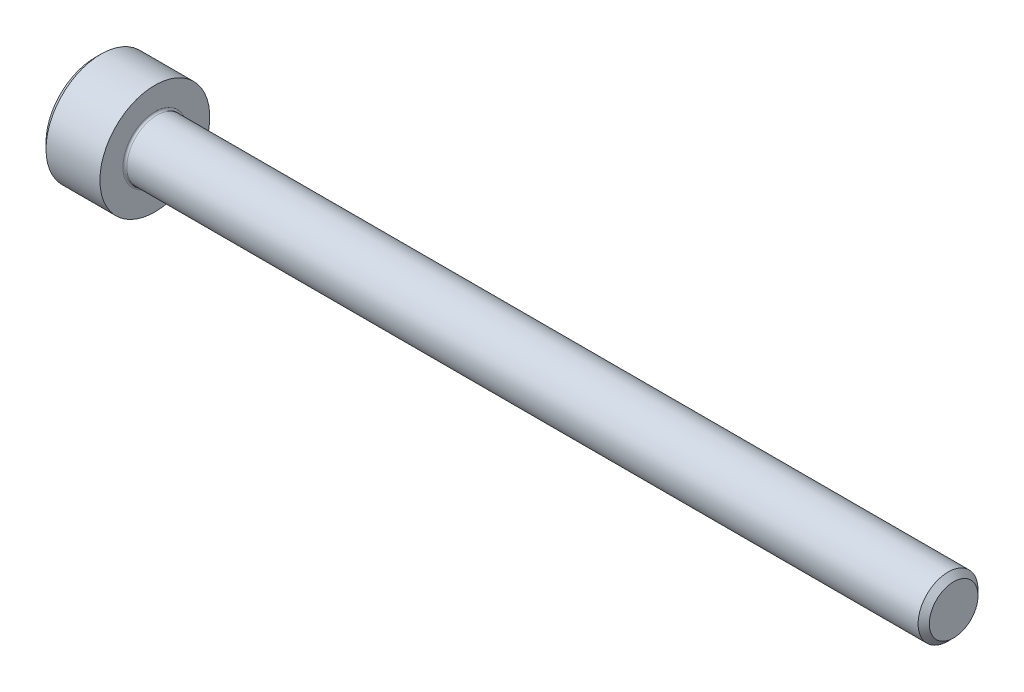
ISO-10303-21;
HEADER;
FILE_DESCRIPTION(('STEP AP214'),'2;1');
FILE_NAME('part.step','',(''),(''),'','','');
FILE_SCHEMA(('AUTOMOTIVE_DESIGN { 1 0 10303 214 1 1 1 1 }'));
ENDSEC;
DATA;
#1=APPLICATION_CONTEXT('core data for automotive mechanical design processes');
#2=APPLICATION_PROTOCOL_DEFINITION('international standard','automotive_design',2000,#1);
#3=PRODUCT_CONTEXT('',#1,'mechanical');
#4=PRODUCT('Part','Part','',(#3));
#5=PRODUCT_RELATED_PRODUCT_CATEGORY('part','',(#4));
#6=PRODUCT_DEFINITION_FORMATION('','',#4);
#7=PRODUCT_DEFINITION_CONTEXT('part definition',#1,'design');
#8=PRODUCT_DEFINITION('design','',#6,#7);
#9=PRODUCT_DEFINITION_SHAPE('','',#8);
#10=(LENGTH_UNIT() NAMED_UNIT(*) SI_UNIT(.MILLI.,.METRE.));
#11=(NAMED_UNIT(*) PLANE_ANGLE_UNIT() SI_UNIT($,.RADIAN.));
#12=(NAMED_UNIT(*) SI_UNIT($,.STERADIAN.) SOLID_ANGLE_UNIT());
#13=UNCERTAINTY_MEASURE_WITH_UNIT(LENGTH_MEASURE(1.E-05),#10,'distance_accuracy_value','');
#14=(GEOMETRIC_REPRESENTATION_CONTEXT(3) GLOBAL_UNCERTAINTY_ASSIGNED_CONTEXT((#13)) GLOBAL_UNIT_ASSIGNED_CONTEXT((#10,
#11,#12)) REPRESENTATION_CONTEXT('',''));
#15=CARTESIAN_POINT('',(0.,0.,0.));
#16=DIRECTION('',(0.,0.,1.));
#17=DIRECTION('',(1.,0.,0.));
#18=AXIS2_PLACEMENT_3D('',#15,#16,#17);
#19=CARTESIAN_POINT('',(0.,0.,0.));
#20=DIRECTION('',(-1.,0.,0.));
#21=DIRECTION('',(0.,0.,1.));
#22=AXIS2_PLACEMENT_3D('',#19,#20,#21);
#23=PLANE('',#22);
#24=DIRECTION('',(0.,-0.499999999999998,0.86602540378444));
#25=VECTOR('',#24,1.);
#26=CARTESIAN_POINT('',(0.,1.47801668912544,0.));
#27=LINE('',#26,#25);
#28=CARTESIAN_POINT('',(0.,1.47801668912544,0.));
#29=VERTEX_POINT('',#28);
#30=CARTESIAN_POINT('',(0.,0.73900834456272,1.28));
#31=VERTEX_POINT('',#30);
#32=EDGE_CURVE('E390',#29,#31,#27,.T.);
#33=ORIENTED_EDGE('',*,*,#32,.T.);
#34=DIRECTION('',(0.,1.,0.));
#35=VECTOR('',#34,1.);
#36=CARTESIAN_POINT('',(0.,-0.739008344562722,1.28));
#37=LINE('',#36,#35);
#38=CARTESIAN_POINT('',(0.,-0.739008344562722,1.28));
#39=VERTEX_POINT('',#38);
#40=EDGE_CURVE('E126',#39,#31,#37,.T.);
#41=ORIENTED_EDGE('',*,*,#40,.F.);
#42=DIRECTION('',(0.,-0.500000000000001,-0.866025403784438));
#43=VECTOR('',#42,1.);
#44=CARTESIAN_POINT('',(0.,-0.739008344562722,1.28));
#45=LINE('',#44,#43);
#46=CARTESIAN_POINT('',(0.,-1.47801668912545,0.));
#47=VERTEX_POINT('',#46);
#48=EDGE_CURVE('E393',#39,#47,#45,.T.);
#49=ORIENTED_EDGE('',*,*,#48,.T.);
#50=DIRECTION('',(0.,0.499999999999998,-0.86602540378444));
#51=VECTOR('',#50,1.);
#52=CARTESIAN_POINT('',(0.,-1.47801668912545,0.));
#53=LINE('',#52,#51);
#54=CARTESIAN_POINT('',(0.,-0.739008344562726,-1.28));
#55=VERTEX_POINT('',#54);
#56=EDGE_CURVE('E396',#47,#55,#53,.T.);
#57=ORIENTED_EDGE('',*,*,#56,.T.);
#58=DIRECTION('',(0.,-1.,0.));
#59=VECTOR('',#58,1.);
#60=CARTESIAN_POINT('',(0.,0.739008344562716,-1.28));
#61=LINE('',#60,#59);
#62=CARTESIAN_POINT('',(0.,0.739008344562716,-1.28));
#63=VERTEX_POINT('',#62);
#64=EDGE_CURVE('E399',#63,#55,#61,.T.);
#65=ORIENTED_EDGE('',*,*,#64,.F.);
#66=DIRECTION('',(0.,-0.500000000000001,-0.866025403784438));
#67=VECTOR('',#66,1.);
#68=CARTESIAN_POINT('',(0.,1.47801668912544,0.));
#69=LINE('',#68,#67);
#70=EDGE_CURVE('E121',#29,#63,#69,.T.);
#71=ORIENTED_EDGE('',*,*,#70,.F.);
#72=EDGE_LOOP('',(#33,#41,#49,#57,#65,#71));
#73=FACE_BOUND('',#72,.T.);
#74=CARTESIAN_POINT('',(0.,0.,0.));
#75=DIRECTION('',(-1.,0.,0.));
#76=DIRECTION('',(0.,0.,1.));
#77=AXIS2_PLACEMENT_3D('',#74,#75,#76);
#78=CIRCLE('',#77,2.45);
#79=CARTESIAN_POINT('',(0.,0.,2.45));
#80=VERTEX_POINT('',#79);
#81=EDGE_CURVE('E137',#80,#80,#78,.T.);
#82=ORIENTED_EDGE('',*,*,#81,.T.);
#83=EDGE_LOOP('',(#82));
#84=FACE_BOUND('',#83,.T.);
#85=ADVANCED_FACE('F34',(#73,#84),#23,.T.);
#86=CARTESIAN_POINT('',(43.,1.2195,0.));
#87=DIRECTION('',(1.,0.,0.));
#88=DIRECTION('',(0.,0.,-1.));
#89=AXIS2_PLACEMENT_3D('',#86,#87,#88);
#90=PLANE('',#89);
#91=CARTESIAN_POINT('',(43.,0.,0.));
#92=DIRECTION('',(-1.,0.,0.));
#93=DIRECTION('',(0.,0.,1.));
#94=AXIS2_PLACEMENT_3D('',#91,#92,#93);
#95=CIRCLE('',#94,1.2195);
#96=CARTESIAN_POINT('',(43.,0.,1.2195));
#97=VERTEX_POINT('',#96);
#98=EDGE_CURVE('E150',#97,#97,#95,.T.);
#99=ORIENTED_EDGE('',*,*,#98,.F.);
#100=EDGE_LOOP('',(#99));
#101=FACE_BOUND('',#100,.T.);
#102=ADVANCED_FACE('F171',(#101),#90,.T.);
#103=CARTESIAN_POINT('',(43.,0.,0.));
#104=DIRECTION('',(-1.,0.,0.));
#105=DIRECTION('',(0.,0.,1.));
#106=AXIS2_PLACEMENT_3D('',#103,#104,#105);
#107=CONICAL_SURFACE('',#106,1.2195,0.785398163397404);
#108=CARTESIAN_POINT('',(42.7195,0.,0.));
#109=DIRECTION('',(-1.,0.,0.));
#110=DIRECTION('',(0.,0.,1.));
#111=AXIS2_PLACEMENT_3D('',#108,#109,#110);
#112=CIRCLE('',#111,1.49999999999998);
#113=CARTESIAN_POINT('',(42.7195,0.,1.49999999999998));
#114=VERTEX_POINT('',#113);
#115=EDGE_CURVE('E147',#114,#114,#112,.T.);
#116=ORIENTED_EDGE('',*,*,#115,.F.);
#117=EDGE_LOOP('',(#116));
#118=FACE_BOUND('',#117,.T.);
#119=ORIENTED_EDGE('',*,*,#98,.T.);
#120=EDGE_LOOP('',(#119));
#121=FACE_BOUND('',#120,.T.);
#122=ADVANCED_FACE('F177',(#118,#121),#107,.T.);
#123=CARTESIAN_POINT('',(-31.75,0.,0.));
#124=DIRECTION('',(-1.,0.,0.));
#125=DIRECTION('',(0.,0.,1.));
#126=AXIS2_PLACEMENT_3D('',#123,#124,#125);
#127=CYLINDRICAL_SURFACE('',#126,1.49999999999999);
#128=CARTESIAN_POINT('',(3.1,0.,0.));
#129=DIRECTION('',(1.,0.,0.));
#130=DIRECTION('',(0.,0.,-1.));
#131=AXIS2_PLACEMENT_3D('',#128,#129,#130);
#132=CIRCLE('',#131,1.49999999999999);
#133=CARTESIAN_POINT('',(3.1,0.,-1.49999999999999));
#134=VERTEX_POINT('',#133);
#135=EDGE_CURVE('E11',#134,#134,#132,.T.);
#136=ORIENTED_EDGE('',*,*,#135,.T.);
#137=EDGE_LOOP('',(#136));
#138=FACE_BOUND('',#137,.T.);
#139=ORIENTED_EDGE('',*,*,#115,.T.);
#140=EDGE_LOOP('',(#139));
#141=FACE_BOUND('',#140,.T.);
#142=ADVANCED_FACE('F188',(#138,#141),#127,.T.);
#143=CARTESIAN_POINT('',(3.,2.75,0.));
#144=DIRECTION('',(1.,0.,0.));
#145=DIRECTION('',(0.,0.,-1.));
#146=AXIS2_PLACEMENT_3D('',#143,#144,#145);
#147=PLANE('',#146);
#148=CARTESIAN_POINT('',(3.,0.,0.));
#149=DIRECTION('',(1.,0.,0.));
#150=DIRECTION('',(0.,0.,-1.));
#151=AXIS2_PLACEMENT_3D('',#148,#149,#150);
#152=CIRCLE('',#151,1.59999999999999);
#153=CARTESIAN_POINT('',(3.,0.,-1.59999999999999));
#154=VERTEX_POINT('',#153);
#155=EDGE_CURVE('E42',#154,#154,#152,.F.);
#156=ORIENTED_EDGE('',*,*,#155,.T.);
#157=EDGE_LOOP('',(#156));
#158=FACE_BOUND('',#157,.T.);
#159=CARTESIAN_POINT('',(3.,0.,0.));
#160=DIRECTION('',(-1.,0.,0.));
#161=DIRECTION('',(0.,0.,1.));
#162=AXIS2_PLACEMENT_3D('',#159,#160,#161);
#163=CIRCLE('',#162,2.75);
#164=CARTESIAN_POINT('',(3.,0.,2.75));
#165=VERTEX_POINT('',#164);
#166=EDGE_CURVE('E144',#165,#165,#163,.T.);
#167=ORIENTED_EDGE('',*,*,#166,.F.);
#168=EDGE_LOOP('',(#167));
#169=FACE_BOUND('',#168,.T.);
#170=ADVANCED_FACE('F155',(#158,#169),#147,.T.);
#171=CARTESIAN_POINT('',(-31.75,0.,0.));
#172=DIRECTION('',(-1.,0.,0.));
#173=DIRECTION('',(0.,0.,1.));
#174=AXIS2_PLACEMENT_3D('',#171,#172,#173);
#175=CYLINDRICAL_SURFACE('',#174,2.75);
#176=ORIENTED_EDGE('',*,*,#166,.T.);
#177=EDGE_LOOP('',(#176));
#178=FACE_BOUND('',#177,.T.);
#179=CARTESIAN_POINT('',(0.300000000000002,0.,0.));
#180=DIRECTION('',(-1.,0.,0.));
#181=DIRECTION('',(0.,0.,1.));
#182=AXIS2_PLACEMENT_3D('',#179,#180,#181);
#183=CIRCLE('',#182,2.75);
#184=CARTESIAN_POINT('',(0.300000000000002,0.,2.75));
#185=VERTEX_POINT('',#184);
#186=EDGE_CURVE('E141',#185,#185,#183,.T.);
#187=ORIENTED_EDGE('',*,*,#186,.F.);
#188=EDGE_LOOP('',(#187));
#189=FACE_BOUND('',#188,.T.);
#190=ADVANCED_FACE('F166',(#178,#189),#175,.T.);
#191=CARTESIAN_POINT('',(0.,0.,0.));
#192=DIRECTION('',(1.,0.,0.));
#193=DIRECTION('',(0.,0.,-1.));
#194=AXIS2_PLACEMENT_3D('',#191,#192,#193);
#195=CONICAL_SURFACE('',#194,2.45,0.78539816339744);
#196=ORIENTED_EDGE('',*,*,#186,.T.);
#197=EDGE_LOOP('',(#196));
#198=FACE_BOUND('',#197,.T.);
#199=ORIENTED_EDGE('',*,*,#81,.F.);
#200=EDGE_LOOP('',(#199));
#201=FACE_BOUND('',#200,.T.);
#202=ADVANCED_FACE('F159',(#198,#201),#195,.T.);
#203=CARTESIAN_POINT('',(3.1,0.,0.));
#204=DIRECTION('',(1.,0.,0.));
#205=DIRECTION('',(0.,0.,-1.));
#206=AXIS2_PLACEMENT_3D('',#203,#204,#205);
#207=TOROIDAL_SURFACE('',#206,1.59999999999999,0.1);
#208=ORIENTED_EDGE('',*,*,#135,.F.);
#209=EDGE_LOOP('',(#208));
#210=FACE_BOUND('',#209,.T.);
#211=ORIENTED_EDGE('',*,*,#155,.F.);
#212=EDGE_LOOP('',(#211));
#213=FACE_BOUND('',#212,.T.);
#214=ADVANCED_FACE('F36',(#210,#213),#207,.F.);
#215=CARTESIAN_POINT('',(1.3,1.47801668912544,0.));
#216=DIRECTION('',(0.,-0.86602540378444,-0.499999999999998));
#217=DIRECTION('',(0.,0.499999999999998,-0.86602540378444));
#218=AXIS2_PLACEMENT_3D('',#215,#216,#217);
#219=PLANE('',#218);
#220=ORIENTED_EDGE('',*,*,#32,.F.);
#221=DIRECTION('',(-1.,0.,0.));
#222=VECTOR('',#221,1.);
#223=CARTESIAN_POINT('',(1.3,1.47801668912544,0.));
#224=LINE('',#223,#222);
#225=CARTESIAN_POINT('',(1.3,1.47801668912544,0.));
#226=VERTEX_POINT('',#225);
#227=EDGE_CURVE('E389',#226,#29,#224,.T.);
#228=ORIENTED_EDGE('',*,*,#227,.F.);
#229=DIRECTION('',(0.,-0.499999999999998,0.86602540378444));
#230=VECTOR('',#229,1.);
#231=CARTESIAN_POINT('',(1.3,1.47801668912544,0.));
#232=LINE('',#231,#230);
#233=CARTESIAN_POINT('',(1.3,1.10851251684408,0.639999999999998));
#234=VERTEX_POINT('',#233);
#235=EDGE_CURVE('E49',#226,#234,#232,.T.);
#236=ORIENTED_EDGE('',*,*,#235,.T.);
#237=CARTESIAN_POINT('',(1.3,0.73900834456272,1.28));
#238=VERTEX_POINT('',#237);
#239=EDGE_CURVE('E107',#234,#238,#232,.T.);
#240=ORIENTED_EDGE('',*,*,#239,.T.);
#241=DIRECTION('',(-1.,0.,0.));
#242=VECTOR('',#241,1.);
#243=CARTESIAN_POINT('',(1.3,0.73900834456272,1.28));
#244=LINE('',#243,#242);
#245=EDGE_CURVE('E119',#238,#31,#244,.T.);
#246=ORIENTED_EDGE('',*,*,#245,.T.);
#247=EDGE_LOOP('',(#220,#228,#236,#240,#246));
#248=FACE_BOUND('',#247,.T.);
#249=ADVANCED_FACE('F118',(#248),#219,.T.);
#250=CARTESIAN_POINT('',(1.3,-0.739008344562722,1.28));
#251=DIRECTION('',(0.,0.,1.));
#252=DIRECTION('',(0.,-1.,0.));
#253=AXIS2_PLACEMENT_3D('',#250,#251,#252);
#254=PLANE('',#253);
#255=ORIENTED_EDGE('',*,*,#40,.T.);
#256=ORIENTED_EDGE('',*,*,#245,.F.);
#257=DIRECTION('',(0.,1.,0.));
#258=VECTOR('',#257,1.);
#259=CARTESIAN_POINT('',(1.3,-0.739008344562722,1.28));
#260=LINE('',#259,#258);
#261=CARTESIAN_POINT('',(1.3,0.,1.28));
#262=VERTEX_POINT('',#261);
#263=EDGE_CURVE('E105',#262,#238,#260,.T.);
#264=ORIENTED_EDGE('',*,*,#263,.F.);
#265=CARTESIAN_POINT('',(1.3,-0.739008344562722,1.28));
#266=VERTEX_POINT('',#265);
#267=EDGE_CURVE('E115',#266,#262,#260,.T.);
#268=ORIENTED_EDGE('',*,*,#267,.F.);
#269=DIRECTION('',(-1.,0.,0.));
#270=VECTOR('',#269,1.);
#271=CARTESIAN_POINT('',(1.3,-0.739008344562722,1.28));
#272=LINE('',#271,#270);
#273=EDGE_CURVE('E128',#266,#39,#272,.T.);
#274=ORIENTED_EDGE('',*,*,#273,.T.);
#275=EDGE_LOOP('',(#255,#256,#264,#268,#274));
#276=FACE_BOUND('',#275,.T.);
#277=ADVANCED_FACE('F123',(#276),#254,.F.);
#278=CARTESIAN_POINT('',(1.3,-0.739008344562722,1.28));
#279=DIRECTION('',(0.,0.866025403784438,-0.500000000000001));
#280=DIRECTION('',(0.,0.500000000000001,0.866025403784438));
#281=AXIS2_PLACEMENT_3D('',#278,#279,#280);
#282=PLANE('',#281);
#283=ORIENTED_EDGE('',*,*,#48,.F.);
#284=ORIENTED_EDGE('',*,*,#273,.F.);
#285=DIRECTION('',(0.,-0.500000000000001,-0.866025403784438));
#286=VECTOR('',#285,1.);
#287=CARTESIAN_POINT('',(1.3,-0.739008344562722,1.28));
#288=LINE('',#287,#286);
#289=CARTESIAN_POINT('',(1.3,-1.10851251684408,0.640000000000002));
#290=VERTEX_POINT('',#289);
#291=EDGE_CURVE('E370',#266,#290,#288,.T.);
#292=ORIENTED_EDGE('',*,*,#291,.T.);
#293=CARTESIAN_POINT('',(1.3,-1.47801668912545,0.));
#294=VERTEX_POINT('',#293);
#295=EDGE_CURVE('E372',#290,#294,#288,.T.);
#296=ORIENTED_EDGE('',*,*,#295,.T.);
#297=DIRECTION('',(-1.,0.,0.));
#298=VECTOR('',#297,1.);
#299=CARTESIAN_POINT('',(1.3,-1.47801668912545,0.));
#300=LINE('',#299,#298);
#301=EDGE_CURVE('E133',#294,#47,#300,.T.);
#302=ORIENTED_EDGE('',*,*,#301,.T.);
#303=EDGE_LOOP('',(#283,#284,#292,#296,#302));
#304=FACE_BOUND('',#303,.T.);
#305=ADVANCED_FACE('F262',(#304),#282,.T.);
#306=CARTESIAN_POINT('',(1.3,-1.47801668912545,0.));
#307=DIRECTION('',(0.,0.86602540378444,0.499999999999998));
#308=DIRECTION('',(0.,-0.499999999999998,0.86602540378444));
#309=AXIS2_PLACEMENT_3D('',#306,#307,#308);
#310=PLANE('',#309);
#311=ORIENTED_EDGE('',*,*,#56,.F.);
#312=ORIENTED_EDGE('',*,*,#301,.F.);
#313=DIRECTION('',(0.,0.499999999999998,-0.86602540378444));
#314=VECTOR('',#313,1.);
#315=CARTESIAN_POINT('',(1.3,-1.47801668912545,0.));
#316=LINE('',#315,#314);
#317=CARTESIAN_POINT('',(1.3,-1.10851251684409,-0.64));
#318=VERTEX_POINT('',#317);
#319=EDGE_CURVE('E375',#294,#318,#316,.T.);
#320=ORIENTED_EDGE('',*,*,#319,.T.);
#321=CARTESIAN_POINT('',(1.3,-0.739008344562726,-1.28));
#322=VERTEX_POINT('',#321);
#323=EDGE_CURVE('E379',#318,#322,#316,.T.);
#324=ORIENTED_EDGE('',*,*,#323,.T.);
#325=DIRECTION('',(-1.,0.,0.));
#326=VECTOR('',#325,1.);
#327=CARTESIAN_POINT('',(1.3,-0.739008344562726,-1.28));
#328=LINE('',#327,#326);
#329=EDGE_CURVE('E408',#322,#55,#328,.T.);
#330=ORIENTED_EDGE('',*,*,#329,.T.);
#331=EDGE_LOOP('',(#311,#312,#320,#324,#330));
#332=FACE_BOUND('',#331,.T.);
#333=ADVANCED_FACE('F270',(#332),#310,.T.);
#334=CARTESIAN_POINT('',(1.3,0.739008344562716,-1.28));
#335=DIRECTION('',(0.,0.,-1.));
#336=DIRECTION('',(0.,1.,0.));
#337=AXIS2_PLACEMENT_3D('',#334,#335,#336);
#338=PLANE('',#337);
#339=ORIENTED_EDGE('',*,*,#64,.T.);
#340=ORIENTED_EDGE('',*,*,#329,.F.);
#341=DIRECTION('',(0.,-1.,0.));
#342=VECTOR('',#341,1.);
#343=CARTESIAN_POINT('',(1.3,0.739008344562716,-1.28));
#344=LINE('',#343,#342);
#345=CARTESIAN_POINT('',(1.3,0.,-1.28));
#346=VERTEX_POINT('',#345);
#347=EDGE_CURVE('E383',#346,#322,#344,.T.);
#348=ORIENTED_EDGE('',*,*,#347,.F.);
#349=CARTESIAN_POINT('',(1.3,0.739008344562716,-1.28));
#350=VERTEX_POINT('',#349);
#351=EDGE_CURVE('E384',#350,#346,#344,.T.);
#352=ORIENTED_EDGE('',*,*,#351,.F.);
#353=DIRECTION('',(-1.,0.,0.));
#354=VECTOR('',#353,1.);
#355=CARTESIAN_POINT('',(1.3,0.739008344562716,-1.28));
#356=LINE('',#355,#354);
#357=EDGE_CURVE('E405',#350,#63,#356,.T.);
#358=ORIENTED_EDGE('',*,*,#357,.T.);
#359=EDGE_LOOP('',(#339,#340,#348,#352,#358));
#360=FACE_BOUND('',#359,.T.);
#361=ADVANCED_FACE('F279',(#360),#338,.F.);
#362=CARTESIAN_POINT('',(1.3,1.47801668912544,0.));
#363=DIRECTION('',(0.,0.866025403784438,-0.500000000000001));
#364=DIRECTION('',(0.,0.500000000000001,0.866025403784438));
#365=AXIS2_PLACEMENT_3D('',#362,#363,#364);
#366=PLANE('',#365);
#367=ORIENTED_EDGE('',*,*,#70,.T.);
#368=ORIENTED_EDGE('',*,*,#357,.F.);
#369=DIRECTION('',(0.,-0.500000000000001,-0.866025403784438));
#370=VECTOR('',#369,1.);
#371=CARTESIAN_POINT('',(1.3,1.47801668912544,0.));
#372=LINE('',#371,#370);
#373=CARTESIAN_POINT('',(1.3,1.10851251684408,-0.640000000000001));
#374=VERTEX_POINT('',#373);
#375=EDGE_CURVE('E387',#374,#350,#372,.T.);
#376=ORIENTED_EDGE('',*,*,#375,.F.);
#377=EDGE_CURVE('E361',#226,#374,#372,.T.);
#378=ORIENTED_EDGE('',*,*,#377,.F.);
#379=ORIENTED_EDGE('',*,*,#227,.T.);
#380=EDGE_LOOP('',(#367,#368,#376,#378,#379));
#381=FACE_BOUND('',#380,.T.);
#382=ADVANCED_FACE('F288',(#381),#366,.F.);
#383=CARTESIAN_POINT('',(1.3,0.73900834456272,1.28));
#384=DIRECTION('',(-1.,0.,0.));
#385=DIRECTION('',(0.,0.,1.));
#386=AXIS2_PLACEMENT_3D('',#383,#384,#385);
#387=PLANE('',#386);
#388=CARTESIAN_POINT('',(1.3,0.,0.));
#389=DIRECTION('',(-1.,0.,0.));
#390=DIRECTION('',(0.,0.,1.));
#391=AXIS2_PLACEMENT_3D('',#388,#389,#390);
#392=CIRCLE('',#391,1.28);
#393=EDGE_CURVE('E127',#290,#262,#392,.T.);
#394=ORIENTED_EDGE('',*,*,#393,.F.);
#395=ORIENTED_EDGE('',*,*,#291,.F.);
#396=ORIENTED_EDGE('',*,*,#267,.T.);
#397=EDGE_LOOP('',(#394,#395,#396));
#398=FACE_BOUND('',#397,.T.);
#399=ADVANCED_FACE('F297',(#398),#387,.T.);
#400=EDGE_CURVE('E131',#318,#290,#392,.T.);
#401=ORIENTED_EDGE('',*,*,#400,.F.);
#402=ORIENTED_EDGE('',*,*,#319,.F.);
#403=ORIENTED_EDGE('',*,*,#295,.F.);
#404=EDGE_LOOP('',(#401,#402,#403));
#405=FACE_BOUND('',#404,.T.);
#406=ADVANCED_FACE('F306',(#405),#387,.T.);
#407=EDGE_CURVE('E414',#346,#318,#392,.T.);
#408=ORIENTED_EDGE('',*,*,#407,.F.);
#409=ORIENTED_EDGE('',*,*,#347,.T.);
#410=ORIENTED_EDGE('',*,*,#323,.F.);
#411=EDGE_LOOP('',(#408,#409,#410));
#412=FACE_BOUND('',#411,.T.);
#413=ADVANCED_FACE('F315',(#412),#387,.T.);
#414=EDGE_CURVE('E364',#374,#346,#392,.T.);
#415=ORIENTED_EDGE('',*,*,#414,.F.);
#416=ORIENTED_EDGE('',*,*,#375,.T.);
#417=ORIENTED_EDGE('',*,*,#351,.T.);
#418=EDGE_LOOP('',(#415,#416,#417));
#419=FACE_BOUND('',#418,.T.);
#420=ADVANCED_FACE('F323',(#419),#387,.T.);
#421=EDGE_CURVE('E138',#234,#374,#392,.T.);
#422=ORIENTED_EDGE('',*,*,#421,.F.);
#423=ORIENTED_EDGE('',*,*,#235,.F.);
#424=ORIENTED_EDGE('',*,*,#377,.T.);
#425=EDGE_LOOP('',(#422,#423,#424));
#426=FACE_BOUND('',#425,.T.);
#427=ADVANCED_FACE('F331',(#426),#387,.T.);
#428=EDGE_CURVE('E110',#262,#234,#392,.T.);
#429=ORIENTED_EDGE('',*,*,#428,.F.);
#430=ORIENTED_EDGE('',*,*,#263,.T.);
#431=ORIENTED_EDGE('',*,*,#239,.F.);
#432=EDGE_LOOP('',(#429,#430,#431));
#433=FACE_BOUND('',#432,.T.);
#434=ADVANCED_FACE('F106',(#433),#387,.T.);
#435=CARTESIAN_POINT('',(1.3,0.,0.));
#436=DIRECTION('',(-1.,0.,0.));
#437=DIRECTION('',(0.,0.,1.));
#438=AXIS2_PLACEMENT_3D('',#435,#436,#437);
#439=CONICAL_SURFACE('',#438,1.28,1.0471975511966);
#440=CARTESIAN_POINT('',(2.03900834456273,0.,0.));
#441=VERTEX_POINT('',#440);
#442=VERTEX_LOOP('',#441);
#443=FACE_BOUND('',#442,.T.);
#444=ORIENTED_EDGE('',*,*,#428,.T.);
#445=ORIENTED_EDGE('',*,*,#421,.T.);
#446=ORIENTED_EDGE('',*,*,#414,.T.);
#447=ORIENTED_EDGE('',*,*,#407,.T.);
#448=ORIENTED_EDGE('',*,*,#400,.T.);
#449=ORIENTED_EDGE('',*,*,#393,.T.);
#450=EDGE_LOOP('',(#444,#445,#446,#447,#448,#449));
#451=FACE_BOUND('',#450,.T.);
#452=ADVANCED_FACE('F181',(#443,#451),#439,.F.);
#453=CLOSED_SHELL('',(#85,#102,#122,#142,#170,#190,#202,#214,#249,#277,#305,#333,#361,#382,#399,
#406,#413,#420,#427,#434,#452));
#454=MANIFOLD_SOLID_BREP('B2',#453);
#455=ADVANCED_BREP_SHAPE_REPRESENTATION('',(#18,#454),#14);
#456=SHAPE_DEFINITION_REPRESENTATION(#9,#455);
ENDSEC;
END-ISO-10303-21;
